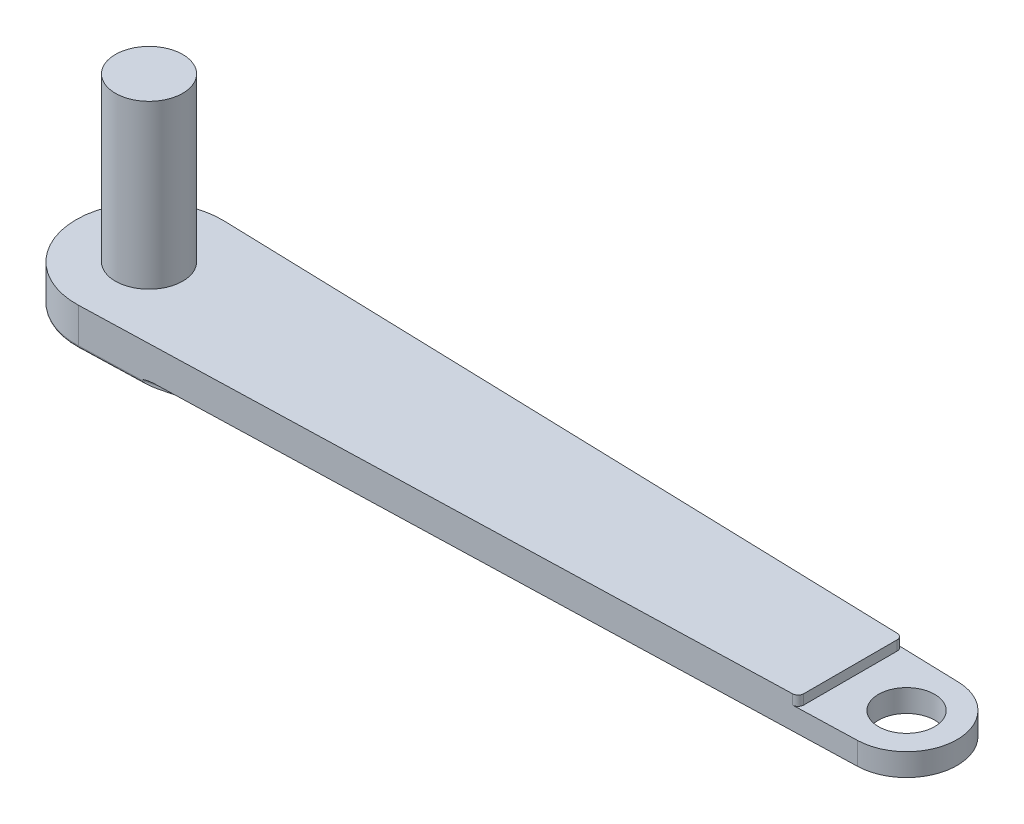
ISO-10303-21;
HEADER;
FILE_DESCRIPTION(('STEP AP214'),'2;1');
FILE_NAME('part.step','',(''),(''),'','','');
FILE_SCHEMA(('AUTOMOTIVE_DESIGN { 1 0 10303 214 1 1 1 1 }'));
ENDSEC;
DATA;
#1=APPLICATION_CONTEXT('core data for automotive mechanical design processes');
#2=APPLICATION_PROTOCOL_DEFINITION('international standard','automotive_design',2000,#1);
#3=PRODUCT_CONTEXT('',#1,'mechanical');
#4=PRODUCT('Part','Part','',(#3));
#5=PRODUCT_RELATED_PRODUCT_CATEGORY('part','',(#4));
#6=PRODUCT_DEFINITION_FORMATION('','',#4);
#7=PRODUCT_DEFINITION_CONTEXT('part definition',#1,'design');
#8=PRODUCT_DEFINITION('design','',#6,#7);
#9=PRODUCT_DEFINITION_SHAPE('','',#8);
#10=(LENGTH_UNIT() NAMED_UNIT(*) SI_UNIT(.MILLI.,.METRE.));
#11=(NAMED_UNIT(*) PLANE_ANGLE_UNIT() SI_UNIT($,.RADIAN.));
#12=(NAMED_UNIT(*) SI_UNIT($,.STERADIAN.) SOLID_ANGLE_UNIT());
#13=UNCERTAINTY_MEASURE_WITH_UNIT(LENGTH_MEASURE(1.E-05),#10,'distance_accuracy_value','');
#14=(GEOMETRIC_REPRESENTATION_CONTEXT(3) GLOBAL_UNCERTAINTY_ASSIGNED_CONTEXT((#13)) GLOBAL_UNIT_ASSIGNED_CONTEXT((#10,
#11,#12)) REPRESENTATION_CONTEXT('',''));
#15=CARTESIAN_POINT('',(0.,0.,0.));
#16=DIRECTION('',(0.,0.,1.));
#17=DIRECTION('',(1.,0.,0.));
#18=AXIS2_PLACEMENT_3D('',#15,#16,#17);
#19=CARTESIAN_POINT('',(111.089422447257,6.75,0.));
#20=DIRECTION('',(0.,-1.,0.));
#21=DIRECTION('',(0.,0.,-1.));
#22=AXIS2_PLACEMENT_3D('',#19,#20,#21);
#23=CYLINDRICAL_SURFACE('',#22,9.);
#24=CARTESIAN_POINT('',(111.089422447257,1.,0.));
#25=DIRECTION('',(0.,-1.,0.));
#26=DIRECTION('',(0.,0.,-1.));
#27=AXIS2_PLACEMENT_3D('',#24,#25,#26);
#28=CIRCLE('',#27,9.);
#29=CARTESIAN_POINT('',(111.356089113924,1.,-8.99604851525874));
#30=VERTEX_POINT('',#29);
#31=CARTESIAN_POINT('',(111.356089113924,1.,8.99604851525874));
#32=VERTEX_POINT('',#31);
#33=EDGE_CURVE('E143',#30,#32,#28,.T.);
#34=ORIENTED_EDGE('',*,*,#33,.F.);
#35=DIRECTION('',(0.,-1.,0.));
#36=VECTOR('',#35,1.);
#37=CARTESIAN_POINT('',(111.356089113924,6.75,-8.99604851525874));
#38=LINE('',#37,#36);
#39=CARTESIAN_POINT('',(111.356089113924,5.,-8.99604851525874));
#40=VERTEX_POINT('',#39);
#41=EDGE_CURVE('E154',#40,#30,#38,.T.);
#42=ORIENTED_EDGE('',*,*,#41,.F.);
#43=CARTESIAN_POINT('',(111.089422447257,5.,0.));
#44=DIRECTION('',(0.,-1.,0.));
#45=DIRECTION('',(0.,0.,-1.));
#46=AXIS2_PLACEMENT_3D('',#43,#44,#45);
#47=CIRCLE('',#46,9.);
#48=CARTESIAN_POINT('',(111.356089113924,5.,8.99604851525874));
#49=VERTEX_POINT('',#48);
#50=EDGE_CURVE('E281',#40,#49,#47,.T.);
#51=ORIENTED_EDGE('',*,*,#50,.T.);
#52=DIRECTION('',(0.,-1.,0.));
#53=VECTOR('',#52,1.);
#54=CARTESIAN_POINT('',(111.356089113924,6.75,8.99604851525874));
#55=LINE('',#54,#53);
#56=EDGE_CURVE('E156',#49,#32,#55,.T.);
#57=ORIENTED_EDGE('',*,*,#56,.T.);
#58=EDGE_LOOP('',(#34,#42,#51,#57));
#59=FACE_BOUND('',#58,.T.);
#60=ADVANCED_FACE('F45',(#59),#23,.T.);
#61=CARTESIAN_POINT('',(111.089422447257,6.75,0.));
#62=DIRECTION('',(0.,-1.,0.));
#63=DIRECTION('',(0.,0.,-1.));
#64=AXIS2_PLACEMENT_3D('',#61,#62,#63);
#65=CYLINDRICAL_SURFACE('',#64,5.);
#66=CARTESIAN_POINT('',(111.089422447257,5.,0.));
#67=DIRECTION('',(0.,-1.,0.));
#68=DIRECTION('',(0.,0.,-1.));
#69=AXIS2_PLACEMENT_3D('',#66,#67,#68);
#70=CIRCLE('',#69,5.);
#71=CARTESIAN_POINT('',(111.089422447257,5.,-5.));
#72=VERTEX_POINT('',#71);
#73=EDGE_CURVE('E179',#72,#72,#70,.T.);
#74=ORIENTED_EDGE('',*,*,#73,.F.);
#75=EDGE_LOOP('',(#74));
#76=FACE_BOUND('',#75,.T.);
#77=CARTESIAN_POINT('',(111.089422447257,1.,0.));
#78=DIRECTION('',(0.,-1.,0.));
#79=DIRECTION('',(0.,0.,-1.));
#80=AXIS2_PLACEMENT_3D('',#77,#78,#79);
#81=CIRCLE('',#80,5.);
#82=CARTESIAN_POINT('',(111.089422447257,1.,-5.));
#83=VERTEX_POINT('',#82);
#84=EDGE_CURVE('E149',#83,#83,#81,.T.);
#85=ORIENTED_EDGE('',*,*,#84,.T.);
#86=EDGE_LOOP('',(#85));
#87=FACE_BOUND('',#86,.T.);
#88=ADVANCED_FACE('F347',(#76,#87),#65,.F.);
#89=CARTESIAN_POINT('',(-23.9105775527429,6.75,0.));
#90=DIRECTION('',(0.,1.,0.));
#91=DIRECTION('',(0.,0.,1.));
#92=AXIS2_PLACEMENT_3D('',#89,#90,#91);
#93=PLANE('',#92);
#94=CARTESIAN_POINT('',(-23.9105775527429,6.75,0.));
#95=DIRECTION('',(0.,1.,0.));
#96=DIRECTION('',(0.,0.,1.));
#97=AXIS2_PLACEMENT_3D('',#94,#95,#96);
#98=CIRCLE('',#97,6.);
#99=CARTESIAN_POINT('',(-23.9105775527429,6.75,-6.));
#100=VERTEX_POINT('',#99);
#101=EDGE_CURVE('E256',#100,#100,#98,.T.);
#102=ORIENTED_EDGE('',*,*,#101,.F.);
#103=EDGE_LOOP('',(#102));
#104=FACE_BOUND('',#103,.T.);
#105=DIRECTION('',(0.,0.,1.));
#106=VECTOR('',#105,1.);
#107=CARTESIAN_POINT('',(101.089422447257,6.75,0.));
#108=LINE('',#107,#106);
#109=CARTESIAN_POINT('',(101.089422447257,6.75,-8.32958306152245));
#110=VERTEX_POINT('',#109);
#111=CARTESIAN_POINT('',(101.089422447257,6.75,8.32958306152245));
#112=VERTEX_POINT('',#111);
#113=EDGE_CURVE('E158',#110,#112,#108,.T.);
#114=ORIENTED_EDGE('',*,*,#113,.F.);
#115=CARTESIAN_POINT('',(100.089422447257,6.75,-8.32958306152245));
#116=DIRECTION('',(0.,1.,0.));
#117=DIRECTION('',(0.,0.,1.));
#118=AXIS2_PLACEMENT_3D('',#115,#116,#117);
#119=CIRCLE('',#118,1.);
#120=CARTESIAN_POINT('',(100.119052076887,6.75,-9.32914400766231));
#121=VERTEX_POINT('',#120);
#122=EDGE_CURVE('E195',#110,#121,#119,.T.);
#123=ORIENTED_EDGE('',*,*,#122,.T.);
#124=DIRECTION('',(-0.99956094613986,0.,-0.0296296296296297));
#125=VECTOR('',#124,1.);
#126=CARTESIAN_POINT('',(-23.5253923675577,6.75,-12.9942922998182));
#127=LINE('',#126,#125);
#128=CARTESIAN_POINT('',(-23.5253923675577,6.75,-12.9942922998182));
#129=VERTEX_POINT('',#128);
#130=EDGE_CURVE('E171',#121,#129,#127,.T.);
#131=ORIENTED_EDGE('',*,*,#130,.T.);
#132=CARTESIAN_POINT('',(-23.9105775527429,6.75,0.));
#133=DIRECTION('',(0.,1.,0.));
#134=DIRECTION('',(0.,0.,1.));
#135=AXIS2_PLACEMENT_3D('',#132,#133,#134);
#136=CIRCLE('',#135,13.);
#137=CARTESIAN_POINT('',(-23.5253923675577,6.75,12.9942922998182));
#138=VERTEX_POINT('',#137);
#139=EDGE_CURVE('E287',#129,#138,#136,.T.);
#140=ORIENTED_EDGE('',*,*,#139,.T.);
#141=DIRECTION('',(0.99956094613986,0.,-0.0296296296296297));
#142=VECTOR('',#141,1.);
#143=CARTESIAN_POINT('',(-23.5253923675577,6.75,12.9942922998182));
#144=LINE('',#143,#142);
#145=CARTESIAN_POINT('',(100.119052076887,6.75,9.32914400766231));
#146=VERTEX_POINT('',#145);
#147=EDGE_CURVE('E291',#138,#146,#144,.T.);
#148=ORIENTED_EDGE('',*,*,#147,.T.);
#149=CARTESIAN_POINT('',(100.089422447257,6.75,8.32958306152245));
#150=DIRECTION('',(0.,1.,0.));
#151=DIRECTION('',(0.,0.,1.));
#152=AXIS2_PLACEMENT_3D('',#149,#150,#151);
#153=CIRCLE('',#152,1.);
#154=EDGE_CURVE('E192',#146,#112,#153,.T.);
#155=ORIENTED_EDGE('',*,*,#154,.T.);
#156=EDGE_LOOP('',(#114,#123,#131,#140,#148,#155));
#157=FACE_BOUND('',#156,.T.);
#158=ADVANCED_FACE('F298',(#104,#157),#93,.T.);
#159=CARTESIAN_POINT('',(-23.9105775527429,0.,0.));
#160=DIRECTION('',(0.,1.,0.));
#161=DIRECTION('',(0.,0.,1.));
#162=AXIS2_PLACEMENT_3D('',#159,#160,#161);
#163=PLANE('',#162);
#164=CARTESIAN_POINT('',(-23.9105775527429,0.,0.));
#165=DIRECTION('',(0.,-1.,0.));
#166=DIRECTION('',(0.,0.,-1.));
#167=AXIS2_PLACEMENT_3D('',#164,#165,#166);
#168=CIRCLE('',#167,2.5);
#169=CARTESIAN_POINT('',(-23.9105775527429,0.,-2.5));
#170=VERTEX_POINT('',#169);
#171=EDGE_CURVE('E265',#170,#170,#168,.T.);
#172=ORIENTED_EDGE('',*,*,#171,.F.);
#173=EDGE_LOOP('',(#172));
#174=FACE_BOUND('',#173,.T.);
#175=DIRECTION('',(0.969724620714392,0.,-0.244201064658466));
#176=VECTOR('',#175,1.);
#177=CARTESIAN_POINT('',(77.5478702123767,0.,-9.99821352416468));
#178=LINE('',#177,#176);
#179=CARTESIAN_POINT('',(-10.2007392770445,0.,12.0990947238516));
#180=VERTEX_POINT('',#179);
#181=CARTESIAN_POINT('',(75.7706878739284,0.,-9.55067428480662));
#182=VERTEX_POINT('',#181);
#183=EDGE_CURVE('E254',#180,#182,#178,.T.);
#184=ORIENTED_EDGE('',*,*,#183,.F.);
#185=DIRECTION('',(0.99956094613986,0.,-0.0296296296296297));
#186=VECTOR('',#185,1.);
#187=CARTESIAN_POINT('',(-23.5402071823725,0.,12.4945118267482));
#188=LINE('',#187,#186);
#189=CARTESIAN_POINT('',(-23.5402071823725,0.,12.4945118267482));
#190=VERTEX_POINT('',#189);
#191=EDGE_CURVE('E69',#180,#190,#188,.F.);
#192=ORIENTED_EDGE('',*,*,#191,.T.);
#193=CARTESIAN_POINT('',(-23.9105775527429,0.,0.));
#194=DIRECTION('',(0.,1.,0.));
#195=DIRECTION('',(0.,0.,1.));
#196=AXIS2_PLACEMENT_3D('',#193,#194,#195);
#197=CIRCLE('',#196,12.5);
#198=CARTESIAN_POINT('',(-23.5402071823725,0.,-12.4945118267482));
#199=VERTEX_POINT('',#198);
#200=EDGE_CURVE('E238',#190,#199,#197,.F.);
#201=ORIENTED_EDGE('',*,*,#200,.T.);
#202=DIRECTION('',(-0.99956094613986,0.,-0.0296296296296297));
#203=VECTOR('',#202,1.);
#204=CARTESIAN_POINT('',(-23.5402071823725,0.,-12.4945118267482));
#205=LINE('',#204,#203);
#206=EDGE_CURVE('E235',#199,#182,#205,.F.);
#207=ORIENTED_EDGE('',*,*,#206,.T.);
#208=EDGE_LOOP('',(#184,#192,#201,#207));
#209=FACE_BOUND('',#208,.T.);
#210=ADVANCED_FACE('F317',(#174,#209),#163,.F.);
#211=CARTESIAN_POINT('',(-23.9105775527429,6.75,0.));
#212=DIRECTION('',(0.,-1.,0.));
#213=DIRECTION('',(0.,0.,-1.));
#214=AXIS2_PLACEMENT_3D('',#211,#212,#213);
#215=CYLINDRICAL_SURFACE('',#214,13.);
#216=DIRECTION('',(0.,-1.,0.));
#217=VECTOR('',#216,1.);
#218=CARTESIAN_POINT('',(-23.5253923675577,6.75,-12.9942922998182));
#219=LINE('',#218,#217);
#220=CARTESIAN_POINT('',(-23.5253923675577,0.5,-12.9942922998182));
#221=VERTEX_POINT('',#220);
#222=EDGE_CURVE('E165',#129,#221,#219,.T.);
#223=ORIENTED_EDGE('',*,*,#222,.T.);
#224=CARTESIAN_POINT('',(-23.9105775527429,0.5,0.));
#225=DIRECTION('',(0.,1.,0.));
#226=DIRECTION('',(0.,0.,1.));
#227=AXIS2_PLACEMENT_3D('',#224,#225,#226);
#228=CIRCLE('',#227,13.);
#229=CARTESIAN_POINT('',(-23.5253923675577,0.5,12.9942922998182));
#230=VERTEX_POINT('',#229);
#231=EDGE_CURVE('E55',#221,#230,#228,.T.);
#232=ORIENTED_EDGE('',*,*,#231,.T.);
#233=DIRECTION('',(0.,-1.,0.));
#234=VECTOR('',#233,1.);
#235=CARTESIAN_POINT('',(-23.5253923675577,6.75,12.9942922998182));
#236=LINE('',#235,#234);
#237=EDGE_CURVE('E169',#138,#230,#236,.T.);
#238=ORIENTED_EDGE('',*,*,#237,.F.);
#239=ORIENTED_EDGE('',*,*,#139,.F.);
#240=EDGE_LOOP('',(#223,#232,#238,#239));
#241=FACE_BOUND('',#240,.T.);
#242=ADVANCED_FACE('F305',(#241),#215,.T.);
#243=CARTESIAN_POINT('',(-23.5253923675577,6.75,12.9942922998182));
#244=DIRECTION('',(-0.0296296296296297,0.,-0.999560946139859));
#245=DIRECTION('',(-0.99956094613986,0.,0.0296296296296297));
#246=AXIS2_PLACEMENT_3D('',#243,#244,#245);
#247=PLANE('',#246);
#248=ORIENTED_EDGE('',*,*,#237,.T.);
#249=DIRECTION('',(0.99956094613986,0.,-0.0296296296296297));
#250=VECTOR('',#249,1.);
#251=CARTESIAN_POINT('',(-23.5253923675577,0.5,12.9942922998182));
#252=LINE('',#251,#250);
#253=CARTESIAN_POINT('',(-12.4521297876233,0.5,12.6660515153996));
#254=VERTEX_POINT('',#253);
#255=EDGE_CURVE('E225',#230,#254,#252,.T.);
#256=ORIENTED_EDGE('',*,*,#255,.T.);
#257=CARTESIAN_POINT('',(-10.1314688692415,0.5,12.5972609891459));
#258=DIRECTION('',(-0.0296296296296297,0.,-0.999560946139859));
#259=DIRECTION('',(0.999560946139859,0.,-0.0296296296296297));
#260=AXIS2_PLACEMENT_3D('',#257,#258,#259);
#261=ELLIPSE('',#260,2.32168026106236,0.5);
#262=CARTESIAN_POINT('',(-10.1314688692415,1.,12.5972609891459));
#263=VERTEX_POINT('',#262);
#264=EDGE_CURVE('E222',#254,#263,#261,.T.);
#265=ORIENTED_EDGE('',*,*,#264,.T.);
#266=DIRECTION('',(-0.999560946139859,0.,0.0296296296296296));
#267=VECTOR('',#266,1.);
#268=CARTESIAN_POINT('',(-12.4521297876233,1.,12.6660515153996));
#269=LINE('',#268,#267);
#270=EDGE_CURVE('E212',#32,#263,#269,.T.);
#271=ORIENTED_EDGE('',*,*,#270,.F.);
#272=ORIENTED_EDGE('',*,*,#56,.F.);
#273=DIRECTION('',(-0.99956094613986,0.,0.0296296296296297));
#274=VECTOR('',#273,1.);
#275=CARTESIAN_POINT('',(-23.5253923675577,5.,12.9942922998182));
#276=LINE('',#275,#274);
#277=CARTESIAN_POINT('',(100.119052076887,5.,9.32914400766231));
#278=VERTEX_POINT('',#277);
#279=EDGE_CURVE('E284',#49,#278,#276,.T.);
#280=ORIENTED_EDGE('',*,*,#279,.T.);
#281=DIRECTION('',(0.,1.,0.));
#282=VECTOR('',#281,1.);
#283=CARTESIAN_POINT('',(100.119052076887,6.75,9.32914400766231));
#284=LINE('',#283,#282);
#285=EDGE_CURVE('E198',#278,#146,#284,.T.);
#286=ORIENTED_EDGE('',*,*,#285,.T.);
#287=ORIENTED_EDGE('',*,*,#147,.F.);
#288=EDGE_LOOP('',(#248,#256,#265,#271,#272,#280,#286,#287));
#289=FACE_BOUND('',#288,.T.);
#290=ADVANCED_FACE('F308',(#289),#247,.F.);
#291=CARTESIAN_POINT('',(-23.5253923675577,6.75,-12.9942922998182));
#292=DIRECTION('',(-0.0296296296296297,0.,0.999560946139859));
#293=DIRECTION('',(0.99956094613986,0.,0.0296296296296297));
#294=AXIS2_PLACEMENT_3D('',#291,#292,#293);
#295=PLANE('',#294);
#296=CARTESIAN_POINT('',(79.3797326006636,0.5,-9.94391227889594));
#297=DIRECTION('',(-0.0296296296296297,0.,0.999560946139859));
#298=DIRECTION('',(0.999560946139859,0.,0.0296296296296297));
#299=AXIS2_PLACEMENT_3D('',#296,#297,#298);
#300=ELLIPSE('',#299,1.8326670278198,0.5);
#301=CARTESIAN_POINT('',(79.3797326006636,1.,-9.94391227889594));
#302=VERTEX_POINT('',#301);
#303=CARTESIAN_POINT('',(77.5478702123767,0.5,-9.99821352416468));
#304=VERTEX_POINT('',#303);
#305=EDGE_CURVE('E219',#302,#304,#300,.T.);
#306=ORIENTED_EDGE('',*,*,#305,.T.);
#307=DIRECTION('',(-0.99956094613986,0.,-0.0296296296296297));
#308=VECTOR('',#307,1.);
#309=CARTESIAN_POINT('',(-23.5253923675577,0.5,-12.9942922998182));
#310=LINE('',#309,#308);
#311=EDGE_CURVE('E11',#304,#221,#310,.T.);
#312=ORIENTED_EDGE('',*,*,#311,.T.);
#313=ORIENTED_EDGE('',*,*,#222,.F.);
#314=ORIENTED_EDGE('',*,*,#130,.F.);
#315=DIRECTION('',(0.,-1.,0.));
#316=VECTOR('',#315,1.);
#317=CARTESIAN_POINT('',(100.119052076887,6.75,-9.32914400766231));
#318=LINE('',#317,#316);
#319=CARTESIAN_POINT('',(100.119052076887,5.,-9.32914400766231));
#320=VERTEX_POINT('',#319);
#321=EDGE_CURVE('E178',#121,#320,#318,.T.);
#322=ORIENTED_EDGE('',*,*,#321,.T.);
#323=DIRECTION('',(0.99956094613986,0.,0.0296296296296297));
#324=VECTOR('',#323,1.);
#325=CARTESIAN_POINT('',(-23.5253923675577,5.,-12.9942922998182));
#326=LINE('',#325,#324);
#327=EDGE_CURVE('E163',#320,#40,#326,.T.);
#328=ORIENTED_EDGE('',*,*,#327,.T.);
#329=ORIENTED_EDGE('',*,*,#41,.T.);
#330=DIRECTION('',(0.99956094613986,0.,0.0296296296296297));
#331=VECTOR('',#330,1.);
#332=CARTESIAN_POINT('',(-23.5253923675577,1.,-12.9942922998182));
#333=LINE('',#332,#331);
#334=EDGE_CURVE('E139',#302,#30,#333,.T.);
#335=ORIENTED_EDGE('',*,*,#334,.F.);
#336=EDGE_LOOP('',(#306,#312,#313,#314,#322,#328,#329,#335));
#337=FACE_BOUND('',#336,.T.);
#338=ADVANCED_FACE('F161',(#337),#295,.F.);
#339=CARTESIAN_POINT('',(101.089422447257,5.,0.));
#340=DIRECTION('',(-1.,0.,0.));
#341=DIRECTION('',(0.,0.,1.));
#342=AXIS2_PLACEMENT_3D('',#339,#340,#341);
#343=PLANE('',#342);
#344=DIRECTION('',(0.,0.,1.));
#345=VECTOR('',#344,1.);
#346=CARTESIAN_POINT('',(101.089422447257,5.,15.6621993505972));
#347=LINE('',#346,#345);
#348=CARTESIAN_POINT('',(101.089422447257,5.,-8.32958306152245));
#349=VERTEX_POINT('',#348);
#350=CARTESIAN_POINT('',(101.089422447257,5.,8.32958306152245));
#351=VERTEX_POINT('',#350);
#352=EDGE_CURVE('E183',#349,#351,#347,.T.);
#353=ORIENTED_EDGE('',*,*,#352,.F.);
#354=DIRECTION('',(0.,-1.,0.));
#355=VECTOR('',#354,1.);
#356=CARTESIAN_POINT('',(101.089422447257,5.,-8.32958306152245));
#357=LINE('',#356,#355);
#358=EDGE_CURVE('E189',#349,#110,#357,.F.);
#359=ORIENTED_EDGE('',*,*,#358,.T.);
#360=ORIENTED_EDGE('',*,*,#113,.T.);
#361=DIRECTION('',(0.,1.,0.));
#362=VECTOR('',#361,1.);
#363=CARTESIAN_POINT('',(101.089422447257,5.,8.32958306152245));
#364=LINE('',#363,#362);
#365=EDGE_CURVE('E186',#112,#351,#364,.F.);
#366=ORIENTED_EDGE('',*,*,#365,.T.);
#367=EDGE_LOOP('',(#353,#359,#360,#366));
#368=FACE_BOUND('',#367,.T.);
#369=ADVANCED_FACE('F331',(#368),#343,.F.);
#370=CARTESIAN_POINT('',(0.,5.,0.));
#371=DIRECTION('',(0.,-1.,0.));
#372=DIRECTION('',(0.,0.,-1.));
#373=AXIS2_PLACEMENT_3D('',#370,#371,#372);
#374=PLANE('',#373);
#375=ORIENTED_EDGE('',*,*,#73,.T.);
#376=EDGE_LOOP('',(#375));
#377=FACE_BOUND('',#376,.T.);
#378=ORIENTED_EDGE('',*,*,#50,.F.);
#379=ORIENTED_EDGE('',*,*,#327,.F.);
#380=CARTESIAN_POINT('',(100.089422447257,5.,-8.32958306152245));
#381=DIRECTION('',(0.,-1.,0.));
#382=DIRECTION('',(0.,0.,-1.));
#383=AXIS2_PLACEMENT_3D('',#380,#381,#382);
#384=CIRCLE('',#383,1.);
#385=EDGE_CURVE('E202',#320,#349,#384,.T.);
#386=ORIENTED_EDGE('',*,*,#385,.T.);
#387=ORIENTED_EDGE('',*,*,#352,.T.);
#388=CARTESIAN_POINT('',(100.089422447257,5.,8.32958306152245));
#389=DIRECTION('',(0.,-1.,0.));
#390=DIRECTION('',(0.,0.,-1.));
#391=AXIS2_PLACEMENT_3D('',#388,#389,#390);
#392=CIRCLE('',#391,1.);
#393=EDGE_CURVE('E205',#351,#278,#392,.T.);
#394=ORIENTED_EDGE('',*,*,#393,.T.);
#395=ORIENTED_EDGE('',*,*,#279,.F.);
#396=EDGE_LOOP('',(#378,#379,#386,#387,#394,#395));
#397=FACE_BOUND('',#396,.T.);
#398=ADVANCED_FACE('F325',(#377,#397),#374,.F.);
#399=CARTESIAN_POINT('',(100.089422447257,6.75,-8.32958306152245));
#400=DIRECTION('',(0.,-1.,0.));
#401=DIRECTION('',(0.,0.,-1.));
#402=AXIS2_PLACEMENT_3D('',#399,#400,#401);
#403=CYLINDRICAL_SURFACE('',#402,1.);
#404=ORIENTED_EDGE('',*,*,#122,.F.);
#405=ORIENTED_EDGE('',*,*,#358,.F.);
#406=ORIENTED_EDGE('',*,*,#385,.F.);
#407=ORIENTED_EDGE('',*,*,#321,.F.);
#408=EDGE_LOOP('',(#404,#405,#406,#407));
#409=FACE_BOUND('',#408,.T.);
#410=ADVANCED_FACE('F335',(#409),#403,.T.);
#411=CARTESIAN_POINT('',(100.089422447257,6.75,8.32958306152245));
#412=DIRECTION('',(0.,1.,0.));
#413=DIRECTION('',(0.,0.,1.));
#414=AXIS2_PLACEMENT_3D('',#411,#412,#413);
#415=CYLINDRICAL_SURFACE('',#414,1.);
#416=ORIENTED_EDGE('',*,*,#393,.F.);
#417=ORIENTED_EDGE('',*,*,#365,.F.);
#418=ORIENTED_EDGE('',*,*,#154,.F.);
#419=ORIENTED_EDGE('',*,*,#285,.F.);
#420=EDGE_LOOP('',(#416,#417,#418,#419));
#421=FACE_BOUND('',#420,.T.);
#422=ADVANCED_FACE('F329',(#421),#415,.T.);
#423=CARTESIAN_POINT('',(111.089422447257,1.,0.));
#424=DIRECTION('',(0.,-1.,0.));
#425=DIRECTION('',(0.,0.,-1.));
#426=AXIS2_PLACEMENT_3D('',#423,#424,#425);
#427=PLANE('',#426);
#428=ORIENTED_EDGE('',*,*,#84,.F.);
#429=EDGE_LOOP('',(#428));
#430=FACE_BOUND('',#429,.T.);
#431=ORIENTED_EDGE('',*,*,#270,.T.);
#432=DIRECTION('',(0.969724620714392,0.,-0.244201064658466));
#433=VECTOR('',#432,1.);
#434=CARTESIAN_POINT('',(106.843645890968,1.,-16.860016832619));
#435=LINE('',#434,#433);
#436=EDGE_CURVE('E146',#263,#302,#435,.T.);
#437=ORIENTED_EDGE('',*,*,#436,.T.);
#438=ORIENTED_EDGE('',*,*,#334,.T.);
#439=ORIENTED_EDGE('',*,*,#33,.T.);
#440=EDGE_LOOP('',(#431,#437,#438,#439));
#441=FACE_BOUND('',#440,.T.);
#442=ADVANCED_FACE('F142',(#430,#441),#427,.T.);
#443=CARTESIAN_POINT('',(77.5478702123767,1.,-9.99821352416468));
#444=DIRECTION('',(-0.244201064658466,0.,-0.969724620714392));
#445=DIRECTION('',(-0.969724620714392,0.,0.244201064658466));
#446=AXIS2_PLACEMENT_3D('',#443,#444,#445);
#447=PLANE('',#446);
#448=DIRECTION('',(0.969724620714392,0.,-0.244201064658466));
#449=VECTOR('',#448,1.);
#450=CARTESIAN_POINT('',(77.5478702123767,0.5,-9.99821352416468));
#451=LINE('',#450,#449);
#452=EDGE_CURVE('E215',#304,#254,#451,.F.);
#453=ORIENTED_EDGE('',*,*,#452,.T.);
#454=CARTESIAN_POINT('',(-10.2007392770445,0.5,12.0990947238517));
#455=DIRECTION('',(-0.244201064658466,0.,-0.969724620714392));
#456=DIRECTION('',(0.969724620714392,0.,-0.244201064658466));
#457=AXIS2_PLACEMENT_3D('',#454,#455,#456);
#458=ELLIPSE('',#457,2.32168026106236,0.5);
#459=EDGE_CURVE('E232',#254,#180,#458,.F.);
#460=ORIENTED_EDGE('',*,*,#459,.T.);
#461=ORIENTED_EDGE('',*,*,#183,.T.);
#462=CARTESIAN_POINT('',(75.7706878739284,0.5,-9.55067428480662));
#463=DIRECTION('',(-0.244201064658466,0.,-0.969724620714392));
#464=DIRECTION('',(-0.969724620714392,0.,0.244201064658466));
#465=AXIS2_PLACEMENT_3D('',#462,#463,#464);
#466=ELLIPSE('',#465,1.8326670278198,0.5);
#467=EDGE_CURVE('E229',#182,#304,#466,.F.);
#468=ORIENTED_EDGE('',*,*,#467,.T.);
#469=EDGE_LOOP('',(#453,#460,#461,#468));
#470=FACE_BOUND('',#469,.T.);
#471=ADVANCED_FACE('F313',(#470),#447,.F.);
#472=CARTESIAN_POINT('',(106.843645890968,0.5,-16.860016832619));
#473=DIRECTION('',(0.969724620714392,0.,-0.244201064658466));
#474=DIRECTION('',(-0.244201064658466,0.,-0.969724620714392));
#475=AXIS2_PLACEMENT_3D('',#472,#473,#474);
#476=CYLINDRICAL_SURFACE('',#475,0.5);
#477=ORIENTED_EDGE('',*,*,#264,.F.);
#478=ORIENTED_EDGE('',*,*,#452,.F.);
#479=ORIENTED_EDGE('',*,*,#305,.F.);
#480=ORIENTED_EDGE('',*,*,#436,.F.);
#481=EDGE_LOOP('',(#477,#478,#479,#480));
#482=FACE_BOUND('',#481,.T.);
#483=ADVANCED_FACE('F321',(#482),#476,.F.);
#484=CARTESIAN_POINT('',(-23.5402071823725,0.5,-12.4945118267482));
#485=DIRECTION('',(-0.99956094613986,0.,-0.0296296296296297));
#486=DIRECTION('',(-0.0296296296296297,0.,0.99956094613986));
#487=AXIS2_PLACEMENT_3D('',#484,#485,#486);
#488=CYLINDRICAL_SURFACE('',#487,0.5);
#489=ORIENTED_EDGE('',*,*,#467,.F.);
#490=ORIENTED_EDGE('',*,*,#206,.F.);
#491=CARTESIAN_POINT('',(-23.5402071823725,0.5,-12.4945118267482));
#492=DIRECTION('',(-0.999560946139859,0.,-0.0296296296296294));
#493=DIRECTION('',(-0.0296296296296294,0.,0.999560946139859));
#494=AXIS2_PLACEMENT_3D('',#491,#492,#493);
#495=CIRCLE('',#494,0.5);
#496=EDGE_CURVE('E49',#221,#199,#495,.T.);
#497=ORIENTED_EDGE('',*,*,#496,.F.);
#498=ORIENTED_EDGE('',*,*,#311,.F.);
#499=EDGE_LOOP('',(#489,#490,#497,#498));
#500=FACE_BOUND('',#499,.T.);
#501=ADVANCED_FACE('F47',(#500),#488,.T.);
#502=CARTESIAN_POINT('',(-23.9105775527429,0.5,0.));
#503=DIRECTION('',(0.,1.,0.));
#504=DIRECTION('',(0.,0.,1.));
#505=AXIS2_PLACEMENT_3D('',#502,#503,#504);
#506=TOROIDAL_SURFACE('',#505,12.5,0.5);
#507=ORIENTED_EDGE('',*,*,#496,.T.);
#508=ORIENTED_EDGE('',*,*,#200,.F.);
#509=CARTESIAN_POINT('',(-23.5402071823725,0.5,12.4945118267482));
#510=DIRECTION('',(0.999560946139859,0.,-0.0296296296296294));
#511=DIRECTION('',(-0.0296296296296294,0.,-0.999560946139859));
#512=AXIS2_PLACEMENT_3D('',#509,#510,#511);
#513=CIRCLE('',#512,0.5);
#514=EDGE_CURVE('E244',#230,#190,#513,.T.);
#515=ORIENTED_EDGE('',*,*,#514,.F.);
#516=ORIENTED_EDGE('',*,*,#231,.F.);
#517=EDGE_LOOP('',(#507,#508,#515,#516));
#518=FACE_BOUND('',#517,.T.);
#519=ADVANCED_FACE('F310',(#518),#506,.T.);
#520=CARTESIAN_POINT('',(-23.5402071823725,0.5,12.4945118267482));
#521=DIRECTION('',(0.99956094613986,0.,-0.0296296296296297));
#522=DIRECTION('',(-0.0296296296296297,0.,-0.99956094613986));
#523=AXIS2_PLACEMENT_3D('',#520,#521,#522);
#524=CYLINDRICAL_SURFACE('',#523,0.5);
#525=ORIENTED_EDGE('',*,*,#514,.T.);
#526=ORIENTED_EDGE('',*,*,#191,.F.);
#527=ORIENTED_EDGE('',*,*,#459,.F.);
#528=ORIENTED_EDGE('',*,*,#255,.F.);
#529=EDGE_LOOP('',(#525,#526,#527,#528));
#530=FACE_BOUND('',#529,.T.);
#531=ADVANCED_FACE('F311',(#530),#524,.T.);
#532=CARTESIAN_POINT('',(-23.9105775527429,35.75,0.));
#533=DIRECTION('',(0.,-1.,0.));
#534=DIRECTION('',(0.,0.,-1.));
#535=AXIS2_PLACEMENT_3D('',#532,#533,#534);
#536=CYLINDRICAL_SURFACE('',#535,6.);
#537=CARTESIAN_POINT('',(-23.9105775527429,35.75,0.));
#538=DIRECTION('',(0.,1.,0.));
#539=DIRECTION('',(0.,0.,1.));
#540=AXIS2_PLACEMENT_3D('',#537,#538,#539);
#541=CIRCLE('',#540,6.);
#542=CARTESIAN_POINT('',(-23.9105775527429,35.75,-6.));
#543=VERTEX_POINT('',#542);
#544=EDGE_CURVE('E247',#543,#543,#541,.T.);
#545=CARTESIAN_POINT('',(-23.9105775527429,35.75,-6.));
#546=CARTESIAN_POINT('',(-23.9105775527429,35.4479166666667,-6.));
#547=CARTESIAN_POINT('',(-23.9105775527429,35.1458333333333,-6.));
#548=CARTESIAN_POINT('',(-23.9105775527429,34.5416666666667,-6.));
#549=CARTESIAN_POINT('',(-23.9105775527429,34.2395833333333,-6.));
#550=CARTESIAN_POINT('',(-23.9105775527429,33.6354166666667,-6.));
#551=CARTESIAN_POINT('',(-23.9105775527429,33.3333333333333,-6.));
#552=CARTESIAN_POINT('',(-23.9105775527429,32.7291666666667,-6.));
#553=CARTESIAN_POINT('',(-23.9105775527429,32.4270833333333,-6.));
#554=CARTESIAN_POINT('',(-23.9105775527429,31.8229166666667,-6.));
#555=CARTESIAN_POINT('',(-23.9105775527429,31.5208333333333,-6.));
#556=CARTESIAN_POINT('',(-23.9105775527429,30.9166666666667,-6.));
#557=CARTESIAN_POINT('',(-23.9105775527429,30.6145833333333,-6.));
#558=CARTESIAN_POINT('',(-23.9105775527429,30.0104166666667,-6.));
#559=CARTESIAN_POINT('',(-23.9105775527429,29.7083333333333,-6.));
#560=CARTESIAN_POINT('',(-23.9105775527429,29.1041666666667,-6.));
#561=CARTESIAN_POINT('',(-23.9105775527429,28.8020833333333,-6.));
#562=CARTESIAN_POINT('',(-23.9105775527429,28.1979166666667,-6.));
#563=CARTESIAN_POINT('',(-23.9105775527429,27.8958333333333,-6.));
#564=CARTESIAN_POINT('',(-23.9105775527429,27.2916666666667,-6.));
#565=CARTESIAN_POINT('',(-23.9105775527429,26.9895833333333,-6.));
#566=CARTESIAN_POINT('',(-23.9105775527429,26.3854166666667,-6.));
#567=CARTESIAN_POINT('',(-23.9105775527429,26.0833333333333,-6.));
#568=CARTESIAN_POINT('',(-23.9105775527429,25.4791666666667,-6.));
#569=CARTESIAN_POINT('',(-23.9105775527429,25.1770833333333,-6.));
#570=CARTESIAN_POINT('',(-23.9105775527429,24.5729166666667,-6.));
#571=CARTESIAN_POINT('',(-23.9105775527429,24.2708333333333,-6.));
#572=CARTESIAN_POINT('',(-23.9105775527429,23.6666666666667,-6.));
#573=CARTESIAN_POINT('',(-23.9105775527429,23.3645833333333,-6.));
#574=CARTESIAN_POINT('',(-23.9105775527429,22.7604166666667,-6.));
#575=CARTESIAN_POINT('',(-23.9105775527429,22.4583333333333,-6.));
#576=CARTESIAN_POINT('',(-23.9105775527429,21.8541666666667,-6.));
#577=CARTESIAN_POINT('',(-23.9105775527429,21.5520833333333,-6.));
#578=CARTESIAN_POINT('',(-23.9105775527429,20.9479166666667,-6.));
#579=CARTESIAN_POINT('',(-23.9105775527429,20.6458333333333,-6.));
#580=CARTESIAN_POINT('',(-23.9105775527429,20.0416666666667,-6.));
#581=CARTESIAN_POINT('',(-23.9105775527429,19.7395833333333,-6.));
#582=CARTESIAN_POINT('',(-23.9105775527429,19.1354166666667,-6.));
#583=CARTESIAN_POINT('',(-23.9105775527429,18.8333333333333,-6.));
#584=CARTESIAN_POINT('',(-23.9105775527429,18.2291666666667,-6.));
#585=CARTESIAN_POINT('',(-23.9105775527429,17.9270833333333,-6.));
#586=CARTESIAN_POINT('',(-23.9105775527429,17.3229166666667,-6.));
#587=CARTESIAN_POINT('',(-23.9105775527429,17.0208333333333,-6.));
#588=CARTESIAN_POINT('',(-23.9105775527429,16.4166666666667,-6.));
#589=CARTESIAN_POINT('',(-23.9105775527429,16.1145833333333,-6.));
#590=CARTESIAN_POINT('',(-23.9105775527429,15.5104166666667,-6.));
#591=CARTESIAN_POINT('',(-23.9105775527429,15.2083333333333,-6.));
#592=CARTESIAN_POINT('',(-23.9105775527429,14.6041666666667,-6.));
#593=CARTESIAN_POINT('',(-23.9105775527429,14.3020833333333,-6.));
#594=CARTESIAN_POINT('',(-23.9105775527429,13.6979166666667,-6.));
#595=CARTESIAN_POINT('',(-23.9105775527429,13.3958333333333,-6.));
#596=CARTESIAN_POINT('',(-23.9105775527429,12.7916666666667,-6.));
#597=CARTESIAN_POINT('',(-23.9105775527429,12.4895833333333,-6.));
#598=CARTESIAN_POINT('',(-23.9105775527429,11.8854166666667,-6.));
#599=CARTESIAN_POINT('',(-23.9105775527429,11.5833333333333,-6.));
#600=CARTESIAN_POINT('',(-23.9105775527429,10.9791666666667,-6.));
#601=CARTESIAN_POINT('',(-23.9105775527429,10.6770833333333,-6.));
#602=CARTESIAN_POINT('',(-23.9105775527429,10.0729166666667,-6.));
#603=CARTESIAN_POINT('',(-23.9105775527429,9.77083333333333,-6.));
#604=CARTESIAN_POINT('',(-23.9105775527429,9.16666666666667,-6.));
#605=CARTESIAN_POINT('',(-23.9105775527429,8.86458333333334,-6.));
#606=CARTESIAN_POINT('',(-23.9105775527429,8.26041666666667,-6.));
#607=CARTESIAN_POINT('',(-23.9105775527429,7.95833333333334,-6.));
#608=CARTESIAN_POINT('',(-23.9105775527429,7.35416666666667,-6.));
#609=CARTESIAN_POINT('',(-23.9105775527429,7.05208333333334,-6.));
#610=CARTESIAN_POINT('',(-23.9105775527429,6.75,-6.));
#611=B_SPLINE_CURVE_WITH_KNOTS('',3,(#545,#546,#547,#548,#549,#550,#551,#552,#553,#554,#555,
#556,#557,#558,#559,#560,#561,#562,#563,#564,#565,#566,#567,#568,#569,#570,#571,#572,#573,#574,
#575,#576,#577,#578,#579,#580,#581,#582,#583,#584,#585,#586,#587,#588,#589,#590,#591,#592,#593,
#594,#595,#596,#597,#598,#599,#600,#601,#602,#603,#604,#605,#606,#607,#608,#609,#610),
.UNSPECIFIED.,.F.,.F.,(4,2,2,2,2,2,2,2,2,2,2,2,2,2,2,2,2,2,2,2,2,2,2,2,2,2,2,2,2,2,2,2,4),(0.,
0.906249999999997,1.81249999999999,2.71875,3.625,4.53125,5.4375,6.34375,7.25,8.15625,
9.06249999999999,9.96874999999999,10.875,11.78125,12.6875,13.59375,14.5,15.40625,16.3125,
17.21875,18.125,19.03125,19.9375,20.84375,21.75,22.65625,23.5625,24.46875,25.375,26.28125,
27.1875,28.09375,29.),.UNSPECIFIED.);
#612=EDGE_CURVE('BSEAM379',#543,#100,#611,.T.);
#613=ORIENTED_EDGE('',*,*,#544,.F.);
#614=ORIENTED_EDGE('',*,*,#101,.T.);
#615=ORIENTED_EDGE('',*,*,#612,.T.);
#616=ORIENTED_EDGE('',*,*,#612,.F.);
#617=EDGE_LOOP('',(#613,#615,#614,#616));
#618=FACE_BOUND('',#617,.T.);
#619=ADVANCED_FACE('F379',(#618),#536,.T.);
#620=CARTESIAN_POINT('',(-23.9105775527429,35.75,0.));
#621=DIRECTION('',(0.,1.,0.));
#622=DIRECTION('',(0.,0.,1.));
#623=AXIS2_PLACEMENT_3D('',#620,#621,#622);
#624=PLANE('',#623);
#625=ORIENTED_EDGE('',*,*,#544,.T.);
#626=EDGE_LOOP('',(#625));
#627=FACE_BOUND('',#626,.T.);
#628=ADVANCED_FACE('F382',(#627),#624,.T.);
#629=CARTESIAN_POINT('',(-23.9105775527429,20.,0.));
#630=DIRECTION('',(0.,-1.,0.));
#631=DIRECTION('',(0.,0.,-1.));
#632=AXIS2_PLACEMENT_3D('',#629,#630,#631);
#633=CYLINDRICAL_SURFACE('',#632,2.5);
#634=CARTESIAN_POINT('',(-23.9105775527429,20.,0.));
#635=DIRECTION('',(0.,-1.,0.));
#636=DIRECTION('',(0.,0.,-1.));
#637=AXIS2_PLACEMENT_3D('',#634,#635,#636);
#638=CIRCLE('',#637,2.5);
#639=CARTESIAN_POINT('',(-23.9105775527429,20.,-2.5));
#640=VERTEX_POINT('',#639);
#641=EDGE_CURVE('E262',#640,#640,#638,.T.);
#642=ORIENTED_EDGE('',*,*,#641,.F.);
#643=EDGE_LOOP('',(#642));
#644=FACE_BOUND('',#643,.T.);
#645=ORIENTED_EDGE('',*,*,#171,.T.);
#646=EDGE_LOOP('',(#645));
#647=FACE_BOUND('',#646,.T.);
#648=ADVANCED_FACE('F385',(#644,#647),#633,.F.);
#649=CARTESIAN_POINT('',(-23.9105775527429,20.,0.));
#650=DIRECTION('',(0.,-1.,0.));
#651=DIRECTION('',(0.,0.,-1.));
#652=AXIS2_PLACEMENT_3D('',#649,#650,#651);
#653=PLANE('',#652);
#654=ORIENTED_EDGE('',*,*,#641,.T.);
#655=EDGE_LOOP('',(#654));
#656=FACE_BOUND('',#655,.T.);
#657=ADVANCED_FACE('F387',(#656),#653,.T.);
#658=CLOSED_SHELL('',(#60,#88,#158,#210,#242,#290,#338,#369,#398,#410,#422,#442,#471,#483,#501,
#519,#531,#619,#628,#648,#657));
#659=MANIFOLD_SOLID_BREP('B2',#658);
#660=ADVANCED_BREP_SHAPE_REPRESENTATION('',(#18,#659),#14);
#661=SHAPE_DEFINITION_REPRESENTATION(#9,#660);
ENDSEC;
END-ISO-10303-21;
